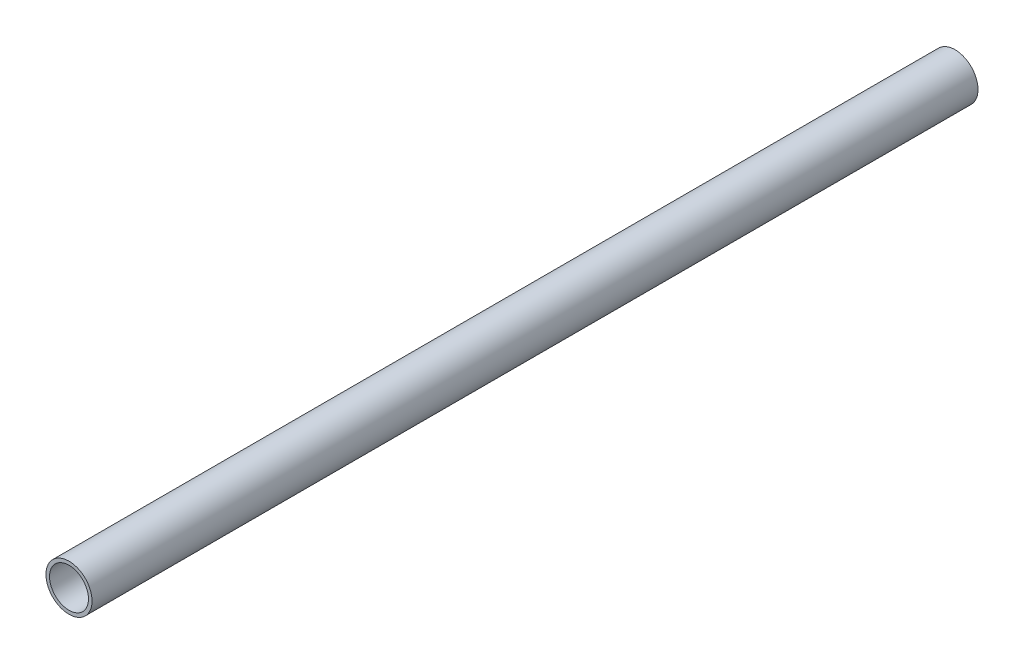
ISO-10303-21;
HEADER;
FILE_DESCRIPTION(('STEP AP214'),'2;1');
FILE_NAME('part.step','',(''),(''),'','','');
FILE_SCHEMA(('AUTOMOTIVE_DESIGN { 1 0 10303 214 1 1 1 1 }'));
ENDSEC;
DATA;
#1=APPLICATION_CONTEXT('core data for automotive mechanical design processes');
#2=APPLICATION_PROTOCOL_DEFINITION('international standard','automotive_design',2000,#1);
#3=PRODUCT_CONTEXT('',#1,'mechanical');
#4=PRODUCT('Part','Part','',(#3));
#5=PRODUCT_RELATED_PRODUCT_CATEGORY('part','',(#4));
#6=PRODUCT_DEFINITION_FORMATION('','',#4);
#7=PRODUCT_DEFINITION_CONTEXT('part definition',#1,'design');
#8=PRODUCT_DEFINITION('design','',#6,#7);
#9=PRODUCT_DEFINITION_SHAPE('','',#8);
#10=(LENGTH_UNIT() NAMED_UNIT(*) SI_UNIT(.MILLI.,.METRE.));
#11=(NAMED_UNIT(*) PLANE_ANGLE_UNIT() SI_UNIT($,.RADIAN.));
#12=(NAMED_UNIT(*) SI_UNIT($,.STERADIAN.) SOLID_ANGLE_UNIT());
#13=UNCERTAINTY_MEASURE_WITH_UNIT(LENGTH_MEASURE(1.E-05),#10,'distance_accuracy_value','');
#14=(GEOMETRIC_REPRESENTATION_CONTEXT(3) GLOBAL_UNCERTAINTY_ASSIGNED_CONTEXT((#13)) GLOBAL_UNIT_ASSIGNED_CONTEXT((#10,
#11,#12)) REPRESENTATION_CONTEXT('',''));
#15=CARTESIAN_POINT('',(0.,0.,0.));
#16=DIRECTION('',(0.,0.,1.));
#17=DIRECTION('',(1.,0.,0.));
#18=AXIS2_PLACEMENT_3D('',#15,#16,#17);
#19=CARTESIAN_POINT('',(0.,0.,500.));
#20=DIRECTION('',(0.,0.,1.));
#21=DIRECTION('',(1.,0.,0.));
#22=AXIS2_PLACEMENT_3D('',#19,#20,#21);
#23=PLANE('',#22);
#24=CARTESIAN_POINT('',(0.,0.,500.));
#25=DIRECTION('',(0.,0.,1.));
#26=DIRECTION('',(1.,0.,0.));
#27=AXIS2_PLACEMENT_3D('',#24,#25,#26);
#28=CIRCLE('',#27,13.);
#29=CARTESIAN_POINT('',(13.,0.,500.));
#30=VERTEX_POINT('',#29);
#31=EDGE_CURVE('E10',#30,#30,#28,.T.);
#32=ORIENTED_EDGE('',*,*,#31,.T.);
#33=EDGE_LOOP('',(#32));
#34=FACE_BOUND('',#33,.T.);
#35=CARTESIAN_POINT('',(0.,0.,500.));
#36=DIRECTION('',(0.,0.,1.));
#37=DIRECTION('',(1.,0.,0.));
#38=AXIS2_PLACEMENT_3D('',#35,#36,#37);
#39=CIRCLE('',#38,11.);
#40=CARTESIAN_POINT('',(11.,0.,500.));
#41=VERTEX_POINT('',#40);
#42=EDGE_CURVE('E48',#41,#41,#39,.T.);
#43=ORIENTED_EDGE('',*,*,#42,.F.);
#44=EDGE_LOOP('',(#43));
#45=FACE_BOUND('',#44,.T.);
#46=ADVANCED_FACE('F40',(#34,#45),#23,.T.);
#47=CARTESIAN_POINT('',(0.,0.,0.));
#48=DIRECTION('',(0.,0.,1.));
#49=DIRECTION('',(1.,0.,0.));
#50=AXIS2_PLACEMENT_3D('',#47,#48,#49);
#51=PLANE('',#50);
#52=CARTESIAN_POINT('',(0.,0.,0.));
#53=DIRECTION('',(0.,0.,1.));
#54=DIRECTION('',(1.,0.,0.));
#55=AXIS2_PLACEMENT_3D('',#52,#53,#54);
#56=CIRCLE('',#55,13.);
#57=CARTESIAN_POINT('',(13.,0.,0.));
#58=VERTEX_POINT('',#57);
#59=EDGE_CURVE('E41',#58,#58,#56,.T.);
#60=ORIENTED_EDGE('',*,*,#59,.F.);
#61=EDGE_LOOP('',(#60));
#62=FACE_BOUND('',#61,.T.);
#63=CARTESIAN_POINT('',(0.,0.,0.));
#64=DIRECTION('',(0.,0.,1.));
#65=DIRECTION('',(1.,0.,0.));
#66=AXIS2_PLACEMENT_3D('',#63,#64,#65);
#67=CIRCLE('',#66,11.);
#68=CARTESIAN_POINT('',(11.,0.,0.));
#69=VERTEX_POINT('',#68);
#70=EDGE_CURVE('E49',#69,#69,#67,.T.);
#71=ORIENTED_EDGE('',*,*,#70,.T.);
#72=EDGE_LOOP('',(#71));
#73=FACE_BOUND('',#72,.T.);
#74=ADVANCED_FACE('F58',(#62,#73),#51,.F.);
#75=CARTESIAN_POINT('',(0.,0.,500.));
#76=DIRECTION('',(0.,0.,-1.));
#77=DIRECTION('',(-1.,0.,0.));
#78=AXIS2_PLACEMENT_3D('',#75,#76,#77);
#79=CYLINDRICAL_SURFACE('',#78,13.);
#80=ORIENTED_EDGE('',*,*,#31,.F.);
#81=EDGE_LOOP('',(#80));
#82=FACE_BOUND('',#81,.T.);
#83=ORIENTED_EDGE('',*,*,#59,.T.);
#84=EDGE_LOOP('',(#83));
#85=FACE_BOUND('',#84,.T.);
#86=ADVANCED_FACE('F39',(#82,#85),#79,.T.);
#87=CARTESIAN_POINT('',(0.,0.,500.));
#88=DIRECTION('',(0.,0.,-1.));
#89=DIRECTION('',(-1.,0.,0.));
#90=AXIS2_PLACEMENT_3D('',#87,#88,#89);
#91=CYLINDRICAL_SURFACE('',#90,11.);
#92=ORIENTED_EDGE('',*,*,#42,.T.);
#93=EDGE_LOOP('',(#92));
#94=FACE_BOUND('',#93,.T.);
#95=ORIENTED_EDGE('',*,*,#70,.F.);
#96=EDGE_LOOP('',(#95));
#97=FACE_BOUND('',#96,.T.);
#98=ADVANCED_FACE('F57',(#94,#97),#91,.F.);
#99=CLOSED_SHELL('',(#46,#74,#86,#98));
#100=MANIFOLD_SOLID_BREP('B2',#99);
#101=ADVANCED_BREP_SHAPE_REPRESENTATION('',(#18,#100),#14);
#102=SHAPE_DEFINITION_REPRESENTATION(#9,#101);
ENDSEC;
END-ISO-10303-21;
